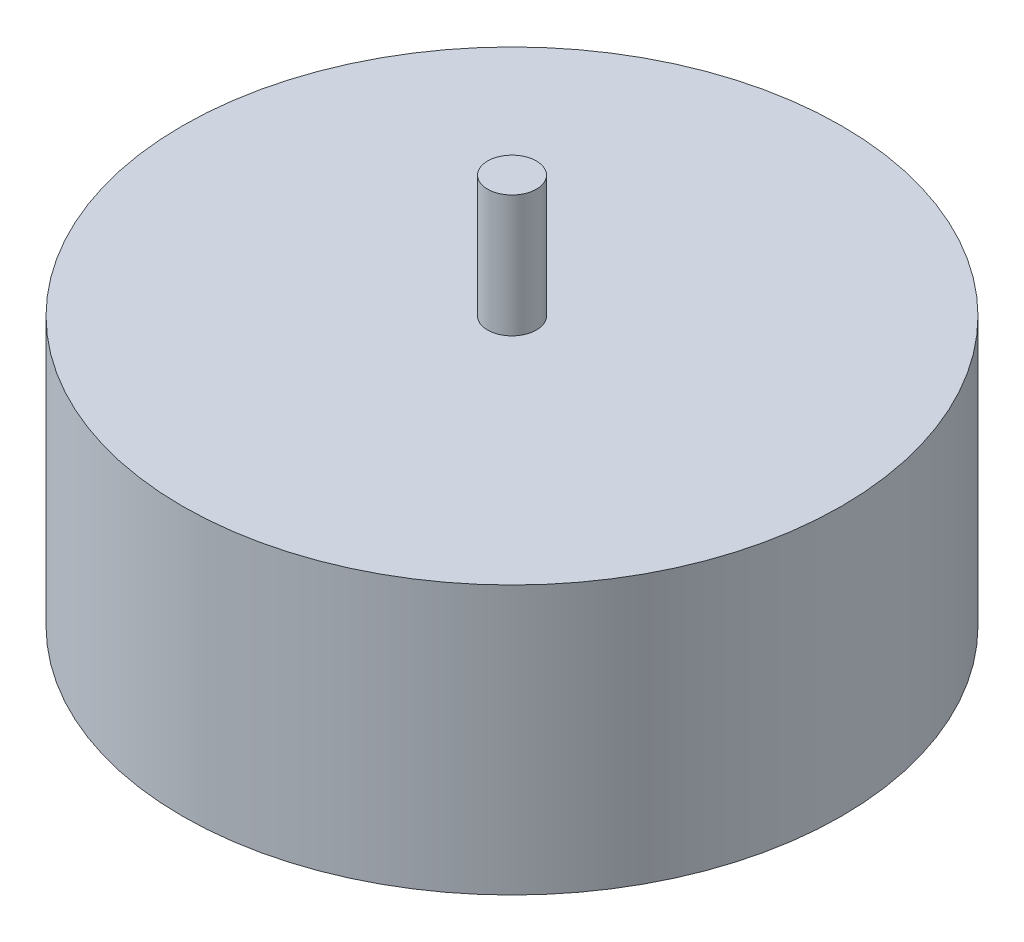
ISO-10303-21;
HEADER;
FILE_DESCRIPTION(('STEP AP214'),'2;1');
FILE_NAME('part.step','',(''),(''),'','','');
FILE_SCHEMA(('AUTOMOTIVE_DESIGN { 1 0 10303 214 1 1 1 1 }'));
ENDSEC;
DATA;
#1=APPLICATION_CONTEXT('core data for automotive mechanical design processes');
#2=APPLICATION_PROTOCOL_DEFINITION('international standard','automotive_design',2000,#1);
#3=PRODUCT_CONTEXT('',#1,'mechanical');
#4=PRODUCT('Part','Part','',(#3));
#5=PRODUCT_RELATED_PRODUCT_CATEGORY('part','',(#4));
#6=PRODUCT_DEFINITION_FORMATION('','',#4);
#7=PRODUCT_DEFINITION_CONTEXT('part definition',#1,'design');
#8=PRODUCT_DEFINITION('design','',#6,#7);
#9=PRODUCT_DEFINITION_SHAPE('','',#8);
#10=(LENGTH_UNIT() NAMED_UNIT(*) SI_UNIT(.MILLI.,.METRE.));
#11=(NAMED_UNIT(*) PLANE_ANGLE_UNIT() SI_UNIT($,.RADIAN.));
#12=(NAMED_UNIT(*) SI_UNIT($,.STERADIAN.) SOLID_ANGLE_UNIT());
#13=UNCERTAINTY_MEASURE_WITH_UNIT(LENGTH_MEASURE(1.E-05),#10,'distance_accuracy_value','');
#14=(GEOMETRIC_REPRESENTATION_CONTEXT(3) GLOBAL_UNCERTAINTY_ASSIGNED_CONTEXT((#13)) GLOBAL_UNIT_ASSIGNED_CONTEXT((#10,
#11,#12)) REPRESENTATION_CONTEXT('',''));
#15=CARTESIAN_POINT('',(0.,0.,0.));
#16=DIRECTION('',(0.,0.,1.));
#17=DIRECTION('',(1.,0.,0.));
#18=AXIS2_PLACEMENT_3D('',#15,#16,#17);
#19=CARTESIAN_POINT('',(0.,22.,0.));
#20=DIRECTION('',(0.,-1.,0.));
#21=DIRECTION('',(0.,0.,-1.));
#22=AXIS2_PLACEMENT_3D('',#19,#20,#21);
#23=CYLINDRICAL_SURFACE('',#22,27.);
#24=CARTESIAN_POINT('',(0.,22.,0.));
#25=DIRECTION('',(0.,1.,0.));
#26=DIRECTION('',(0.,0.,1.));
#27=AXIS2_PLACEMENT_3D('',#24,#25,#26);
#28=CIRCLE('',#27,27.);
#29=CARTESIAN_POINT('',(0.,22.,27.));
#30=VERTEX_POINT('',#29);
#31=EDGE_CURVE('E45',#30,#30,#28,.T.);
#32=ORIENTED_EDGE('',*,*,#31,.F.);
#33=EDGE_LOOP('',(#32));
#34=FACE_BOUND('',#33,.T.);
#35=CARTESIAN_POINT('',(0.,0.,0.));
#36=DIRECTION('',(0.,1.,0.));
#37=DIRECTION('',(0.,0.,1.));
#38=AXIS2_PLACEMENT_3D('',#35,#36,#37);
#39=CIRCLE('',#38,27.);
#40=CARTESIAN_POINT('',(0.,0.,27.));
#41=VERTEX_POINT('',#40);
#42=EDGE_CURVE('E51',#41,#41,#39,.T.);
#43=ORIENTED_EDGE('',*,*,#42,.T.);
#44=EDGE_LOOP('',(#43));
#45=FACE_BOUND('',#44,.T.);
#46=ADVANCED_FACE('F37',(#34,#45),#23,.T.);
#47=CARTESIAN_POINT('',(0.,22.,0.));
#48=DIRECTION('',(0.,1.,0.));
#49=DIRECTION('',(0.,0.,1.));
#50=AXIS2_PLACEMENT_3D('',#47,#48,#49);
#51=PLANE('',#50);
#52=CARTESIAN_POINT('',(0.,22.,0.));
#53=DIRECTION('',(0.,1.,0.));
#54=DIRECTION('',(0.,0.,1.));
#55=AXIS2_PLACEMENT_3D('',#52,#53,#54);
#56=CIRCLE('',#55,2.);
#57=CARTESIAN_POINT('',(0.,22.,2.));
#58=VERTEX_POINT('',#57);
#59=EDGE_CURVE('E10',#58,#58,#56,.T.);
#60=ORIENTED_EDGE('',*,*,#59,.F.);
#61=EDGE_LOOP('',(#60));
#62=FACE_BOUND('',#61,.T.);
#63=ORIENTED_EDGE('',*,*,#31,.T.);
#64=EDGE_LOOP('',(#63));
#65=FACE_BOUND('',#64,.T.);
#66=ADVANCED_FACE('F88',(#62,#65),#51,.T.);
#67=CARTESIAN_POINT('',(0.,0.,0.));
#68=DIRECTION('',(0.,1.,0.));
#69=DIRECTION('',(0.,0.,1.));
#70=AXIS2_PLACEMENT_3D('',#67,#68,#69);
#71=PLANE('',#70);
#72=CARTESIAN_POINT('',(0.,0.,0.));
#73=DIRECTION('',(0.,1.,0.));
#74=DIRECTION('',(0.,0.,1.));
#75=AXIS2_PLACEMENT_3D('',#72,#73,#74);
#76=CIRCLE('',#75,2.);
#77=CARTESIAN_POINT('',(0.,0.,2.));
#78=VERTEX_POINT('',#77);
#79=EDGE_CURVE('E40',#78,#78,#76,.T.);
#80=ORIENTED_EDGE('',*,*,#79,.T.);
#81=EDGE_LOOP('',(#80));
#82=FACE_BOUND('',#81,.T.);
#83=ORIENTED_EDGE('',*,*,#42,.F.);
#84=EDGE_LOOP('',(#83));
#85=FACE_BOUND('',#84,.T.);
#86=ADVANCED_FACE('F93',(#82,#85),#71,.F.);
#87=CARTESIAN_POINT('',(0.,-8.48000000000001,0.));
#88=DIRECTION('',(0.,1.,0.));
#89=DIRECTION('',(0.,0.,1.));
#90=AXIS2_PLACEMENT_3D('',#87,#88,#89);
#91=PLANE('',#90);
#92=CARTESIAN_POINT('',(0.,-8.48000000000001,0.));
#93=DIRECTION('',(0.,1.,0.));
#94=DIRECTION('',(0.,0.,1.));
#95=AXIS2_PLACEMENT_3D('',#92,#93,#94);
#96=CIRCLE('',#95,2.);
#97=CARTESIAN_POINT('',(0.,-8.48000000000001,2.));
#98=VERTEX_POINT('',#97);
#99=EDGE_CURVE('E54',#98,#98,#96,.T.);
#100=ORIENTED_EDGE('',*,*,#99,.F.);
#101=EDGE_LOOP('',(#100));
#102=FACE_BOUND('',#101,.T.);
#103=ADVANCED_FACE('F84',(#102),#91,.F.);
#104=CARTESIAN_POINT('',(0.,-8.48000000000001,0.));
#105=DIRECTION('',(0.,1.,0.));
#106=DIRECTION('',(0.,0.,1.));
#107=AXIS2_PLACEMENT_3D('',#104,#105,#106);
#108=CYLINDRICAL_SURFACE('',#107,2.);
#109=CARTESIAN_POINT('',(0.,-8.48000000000001,2.));
#110=CARTESIAN_POINT('',(0.,-8.39166666666667,2.));
#111=CARTESIAN_POINT('',(0.,-8.30333333333334,2.));
#112=CARTESIAN_POINT('',(0.,-8.12666666666667,2.));
#113=CARTESIAN_POINT('',(0.,-8.03833333333334,2.));
#114=CARTESIAN_POINT('',(0.,-7.86166666666667,2.));
#115=CARTESIAN_POINT('',(0.,-7.77333333333334,2.));
#116=CARTESIAN_POINT('',(0.,-7.59666666666667,2.));
#117=CARTESIAN_POINT('',(0.,-7.50833333333334,2.));
#118=CARTESIAN_POINT('',(0.,-7.33166666666667,2.));
#119=CARTESIAN_POINT('',(0.,-7.24333333333334,2.));
#120=CARTESIAN_POINT('',(0.,-7.06666666666667,2.));
#121=CARTESIAN_POINT('',(0.,-6.97833333333334,2.));
#122=CARTESIAN_POINT('',(0.,-6.80166666666667,2.));
#123=CARTESIAN_POINT('',(0.,-6.71333333333334,2.));
#124=CARTESIAN_POINT('',(0.,-6.53666666666667,2.));
#125=CARTESIAN_POINT('',(0.,-6.44833333333334,2.));
#126=CARTESIAN_POINT('',(0.,-6.27166666666667,2.));
#127=CARTESIAN_POINT('',(0.,-6.18333333333334,2.));
#128=CARTESIAN_POINT('',(0.,-6.00666666666667,2.));
#129=CARTESIAN_POINT('',(0.,-5.91833333333334,2.));
#130=CARTESIAN_POINT('',(0.,-5.74166666666667,2.));
#131=CARTESIAN_POINT('',(0.,-5.65333333333334,2.));
#132=CARTESIAN_POINT('',(0.,-5.47666666666667,2.));
#133=CARTESIAN_POINT('',(0.,-5.38833333333334,2.));
#134=CARTESIAN_POINT('',(0.,-5.21166666666667,2.));
#135=CARTESIAN_POINT('',(0.,-5.12333333333334,2.));
#136=CARTESIAN_POINT('',(0.,-4.94666666666667,2.));
#137=CARTESIAN_POINT('',(0.,-4.85833333333334,2.));
#138=CARTESIAN_POINT('',(0.,-4.68166666666667,2.));
#139=CARTESIAN_POINT('',(0.,-4.59333333333334,2.));
#140=CARTESIAN_POINT('',(0.,-4.41666666666667,2.));
#141=CARTESIAN_POINT('',(0.,-4.32833333333334,2.));
#142=CARTESIAN_POINT('',(0.,-4.15166666666667,2.));
#143=CARTESIAN_POINT('',(0.,-4.06333333333334,2.));
#144=CARTESIAN_POINT('',(0.,-3.88666666666667,2.));
#145=CARTESIAN_POINT('',(0.,-3.79833333333334,2.));
#146=CARTESIAN_POINT('',(0.,-3.62166666666667,2.));
#147=CARTESIAN_POINT('',(0.,-3.53333333333334,2.));
#148=CARTESIAN_POINT('',(0.,-3.35666666666667,2.));
#149=CARTESIAN_POINT('',(0.,-3.26833333333334,2.));
#150=CARTESIAN_POINT('',(0.,-3.09166666666667,2.));
#151=CARTESIAN_POINT('',(0.,-3.00333333333334,2.));
#152=CARTESIAN_POINT('',(0.,-2.82666666666667,2.));
#153=CARTESIAN_POINT('',(0.,-2.73833333333334,2.));
#154=CARTESIAN_POINT('',(0.,-2.56166666666667,2.));
#155=CARTESIAN_POINT('',(0.,-2.47333333333334,2.));
#156=CARTESIAN_POINT('',(0.,-2.29666666666667,2.));
#157=CARTESIAN_POINT('',(0.,-2.20833333333334,2.));
#158=CARTESIAN_POINT('',(0.,-2.03166666666667,2.));
#159=CARTESIAN_POINT('',(0.,-1.94333333333334,2.));
#160=CARTESIAN_POINT('',(0.,-1.76666666666667,2.));
#161=CARTESIAN_POINT('',(0.,-1.67833333333334,2.));
#162=CARTESIAN_POINT('',(0.,-1.50166666666667,2.));
#163=CARTESIAN_POINT('',(0.,-1.41333333333334,2.));
#164=CARTESIAN_POINT('',(0.,-1.23666666666667,2.));
#165=CARTESIAN_POINT('',(0.,-1.14833333333334,2.));
#166=CARTESIAN_POINT('',(0.,-0.971666666666669,2.));
#167=CARTESIAN_POINT('',(0.,-0.883333333333336,2.));
#168=CARTESIAN_POINT('',(0.,-0.706666666666669,2.));
#169=CARTESIAN_POINT('',(0.,-0.618333333333336,2.));
#170=CARTESIAN_POINT('',(0.,-0.441666666666669,2.));
#171=CARTESIAN_POINT('',(0.,-0.353333333333335,2.));
#172=CARTESIAN_POINT('',(0.,-0.176666666666668,2.));
#173=CARTESIAN_POINT('',(0.,-0.0883333333333351,2.));
#174=CARTESIAN_POINT('',(0.,0.,2.));
#175=B_SPLINE_CURVE_WITH_KNOTS('',3,(#109,#110,#111,#112,#113,#114,#115,#116,#117,#118,#119,
#120,#121,#122,#123,#124,#125,#126,#127,#128,#129,#130,#131,#132,#133,#134,#135,#136,#137,#138,
#139,#140,#141,#142,#143,#144,#145,#146,#147,#148,#149,#150,#151,#152,#153,#154,#155,#156,#157,
#158,#159,#160,#161,#162,#163,#164,#165,#166,#167,#168,#169,#170,#171,#172,#173,#174),
.UNSPECIFIED.,.F.,.F.,(4,2,2,2,2,2,2,2,2,2,2,2,2,2,2,2,2,2,2,2,2,2,2,2,2,2,2,2,2,2,2,2,4),(0.,
0.265,0.529999999999999,0.795,1.06,1.325,1.59,1.855,2.12,2.385,2.65,2.915,3.18,3.445,3.71,3.975,
4.24,4.505,4.77,5.035,5.3,5.565,5.83,6.095,6.36,6.625,6.89,7.155,7.42,7.685,7.95,8.215,8.48),.UNSPECIFIED.);
#176=EDGE_CURVE('BSEAM77',#98,#78,#175,.T.);
#177=ORIENTED_EDGE('',*,*,#99,.T.);
#178=ORIENTED_EDGE('',*,*,#79,.F.);
#179=ORIENTED_EDGE('',*,*,#176,.T.);
#180=ORIENTED_EDGE('',*,*,#176,.F.);
#181=EDGE_LOOP('',(#177,#179,#178,#180));
#182=FACE_BOUND('',#181,.T.);
#183=ADVANCED_FACE('F77',(#182),#108,.T.);
#184=CARTESIAN_POINT('',(0.,32.,0.));
#185=DIRECTION('',(0.,1.,0.));
#186=DIRECTION('',(0.,0.,1.));
#187=AXIS2_PLACEMENT_3D('',#184,#185,#186);
#188=CIRCLE('',#187,2.);
#189=CARTESIAN_POINT('',(0.,32.,2.));
#190=VERTEX_POINT('',#189);
#191=EDGE_CURVE('E66',#190,#190,#188,.T.);
#192=CARTESIAN_POINT('',(0.,22.,2.));
#193=CARTESIAN_POINT('',(0.,22.1041666666667,2.));
#194=CARTESIAN_POINT('',(0.,22.2083333333333,2.));
#195=CARTESIAN_POINT('',(0.,22.4166666666667,2.));
#196=CARTESIAN_POINT('',(0.,22.5208333333333,2.));
#197=CARTESIAN_POINT('',(0.,22.7291666666667,2.));
#198=CARTESIAN_POINT('',(0.,22.8333333333333,2.));
#199=CARTESIAN_POINT('',(0.,23.0416666666667,2.));
#200=CARTESIAN_POINT('',(0.,23.1458333333333,2.));
#201=CARTESIAN_POINT('',(0.,23.3541666666667,2.));
#202=CARTESIAN_POINT('',(0.,23.4583333333333,2.));
#203=CARTESIAN_POINT('',(0.,23.6666666666667,2.));
#204=CARTESIAN_POINT('',(0.,23.7708333333333,2.));
#205=CARTESIAN_POINT('',(0.,23.9791666666667,2.));
#206=CARTESIAN_POINT('',(0.,24.0833333333333,2.));
#207=CARTESIAN_POINT('',(0.,24.2916666666667,2.));
#208=CARTESIAN_POINT('',(0.,24.3958333333333,2.));
#209=CARTESIAN_POINT('',(0.,24.6041666666667,2.));
#210=CARTESIAN_POINT('',(0.,24.7083333333333,2.));
#211=CARTESIAN_POINT('',(0.,24.9166666666667,2.));
#212=CARTESIAN_POINT('',(0.,25.0208333333333,2.));
#213=CARTESIAN_POINT('',(0.,25.2291666666667,2.));
#214=CARTESIAN_POINT('',(0.,25.3333333333333,2.));
#215=CARTESIAN_POINT('',(0.,25.5416666666667,2.));
#216=CARTESIAN_POINT('',(0.,25.6458333333333,2.));
#217=CARTESIAN_POINT('',(0.,25.8541666666667,2.));
#218=CARTESIAN_POINT('',(0.,25.9583333333333,2.));
#219=CARTESIAN_POINT('',(0.,26.1666666666667,2.));
#220=CARTESIAN_POINT('',(0.,26.2708333333333,2.));
#221=CARTESIAN_POINT('',(0.,26.4791666666667,2.));
#222=CARTESIAN_POINT('',(0.,26.5833333333333,2.));
#223=CARTESIAN_POINT('',(0.,26.7916666666667,2.));
#224=CARTESIAN_POINT('',(0.,26.8958333333333,2.));
#225=CARTESIAN_POINT('',(0.,27.1041666666667,2.));
#226=CARTESIAN_POINT('',(0.,27.2083333333333,2.));
#227=CARTESIAN_POINT('',(0.,27.4166666666667,2.));
#228=CARTESIAN_POINT('',(0.,27.5208333333333,2.));
#229=CARTESIAN_POINT('',(0.,27.7291666666667,2.));
#230=CARTESIAN_POINT('',(0.,27.8333333333333,2.));
#231=CARTESIAN_POINT('',(0.,28.0416666666667,2.));
#232=CARTESIAN_POINT('',(0.,28.1458333333333,2.));
#233=CARTESIAN_POINT('',(0.,28.3541666666667,2.));
#234=CARTESIAN_POINT('',(0.,28.4583333333333,2.));
#235=CARTESIAN_POINT('',(0.,28.6666666666667,2.));
#236=CARTESIAN_POINT('',(0.,28.7708333333333,2.));
#237=CARTESIAN_POINT('',(0.,28.9791666666667,2.));
#238=CARTESIAN_POINT('',(0.,29.0833333333333,2.));
#239=CARTESIAN_POINT('',(0.,29.2916666666667,2.));
#240=CARTESIAN_POINT('',(0.,29.3958333333333,2.));
#241=CARTESIAN_POINT('',(0.,29.6041666666667,2.));
#242=CARTESIAN_POINT('',(0.,29.7083333333333,2.));
#243=CARTESIAN_POINT('',(0.,29.9166666666667,2.));
#244=CARTESIAN_POINT('',(0.,30.0208333333333,2.));
#245=CARTESIAN_POINT('',(0.,30.2291666666667,2.));
#246=CARTESIAN_POINT('',(0.,30.3333333333333,2.));
#247=CARTESIAN_POINT('',(0.,30.5416666666667,2.));
#248=CARTESIAN_POINT('',(0.,30.6458333333333,2.));
#249=CARTESIAN_POINT('',(0.,30.8541666666667,2.));
#250=CARTESIAN_POINT('',(0.,30.9583333333333,2.));
#251=CARTESIAN_POINT('',(0.,31.1666666666667,2.));
#252=CARTESIAN_POINT('',(0.,31.2708333333333,2.));
#253=CARTESIAN_POINT('',(0.,31.4791666666667,2.));
#254=CARTESIAN_POINT('',(0.,31.5833333333333,2.));
#255=CARTESIAN_POINT('',(0.,31.7916666666667,2.));
#256=CARTESIAN_POINT('',(0.,31.8958333333333,2.));
#257=CARTESIAN_POINT('',(0.,32.,2.));
#258=B_SPLINE_CURVE_WITH_KNOTS('',3,(#192,#193,#194,#195,#196,#197,#198,#199,#200,#201,#202,
#203,#204,#205,#206,#207,#208,#209,#210,#211,#212,#213,#214,#215,#216,#217,#218,#219,#220,#221,
#222,#223,#224,#225,#226,#227,#228,#229,#230,#231,#232,#233,#234,#235,#236,#237,#238,#239,#240,
#241,#242,#243,#244,#245,#246,#247,#248,#249,#250,#251,#252,#253,#254,#255,#256,#257),
.UNSPECIFIED.,.F.,.F.,(4,2,2,2,2,2,2,2,2,2,2,2,2,2,2,2,2,2,2,2,2,2,2,2,2,2,2,2,2,2,2,2,4),(0.,
0.3125,0.625000000000001,0.937499999999997,1.25,1.5625,1.875,2.1875,2.5,2.81249999999999,
3.12499999999999,3.43749999999999,3.74999999999999,4.06249999999999,4.37499999999999,
4.68749999999999,4.99999999999999,5.31249999999999,5.62499999999999,5.93749999999999,6.25,
6.5625,6.875,7.1875,7.49999999999999,7.8125,8.12499999999999,8.43749999999999,8.74999999999999,
9.06249999999999,9.37499999999999,9.68749999999999,9.99999999999999),.UNSPECIFIED.);
#259=EDGE_CURVE('BSEAM75',#58,#190,#258,.T.);
#260=ORIENTED_EDGE('',*,*,#59,.T.);
#261=ORIENTED_EDGE('',*,*,#191,.F.);
#262=ORIENTED_EDGE('',*,*,#259,.T.);
#263=ORIENTED_EDGE('',*,*,#259,.F.);
#264=EDGE_LOOP('',(#260,#262,#261,#263));
#265=FACE_BOUND('',#264,.T.);
#266=ADVANCED_FACE('F75',(#265),#108,.T.);
#267=CARTESIAN_POINT('',(0.,32.,0.));
#268=DIRECTION('',(0.,1.,0.));
#269=DIRECTION('',(0.,0.,1.));
#270=AXIS2_PLACEMENT_3D('',#267,#268,#269);
#271=PLANE('',#270);
#272=ORIENTED_EDGE('',*,*,#191,.T.);
#273=EDGE_LOOP('',(#272));
#274=FACE_BOUND('',#273,.T.);
#275=ADVANCED_FACE('F73',(#274),#271,.T.);
#276=CLOSED_SHELL('',(#46,#66,#86,#103,#183,#266,#275));
#277=MANIFOLD_SOLID_BREP('B2',#276);
#278=ADVANCED_BREP_SHAPE_REPRESENTATION('',(#18,#277),#14);
#279=SHAPE_DEFINITION_REPRESENTATION(#9,#278);
ENDSEC;
END-ISO-10303-21;
